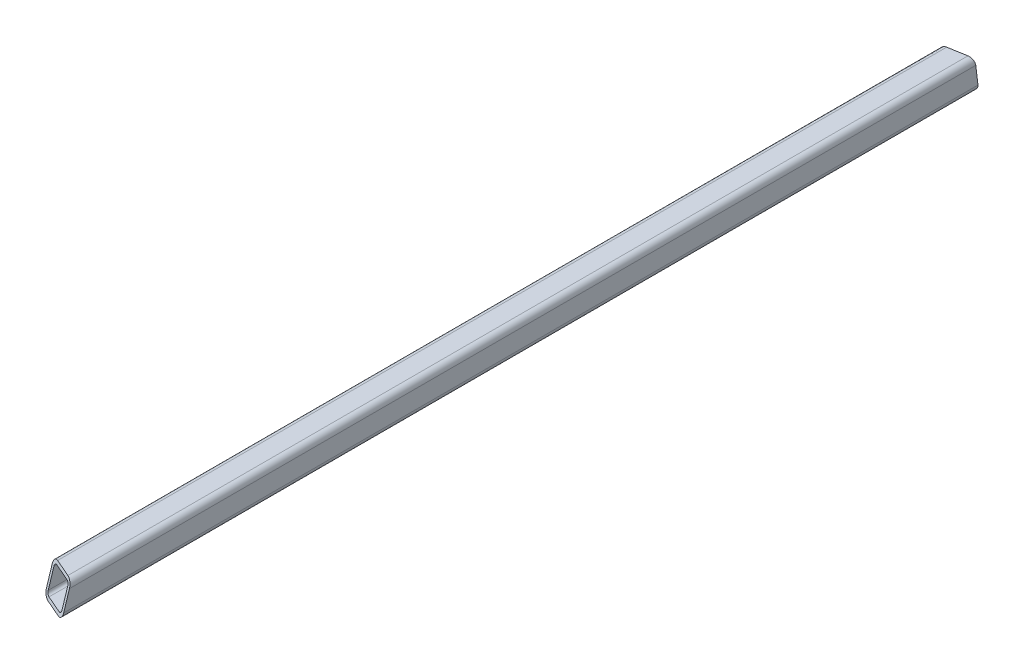
ISO-10303-21;
HEADER;
FILE_DESCRIPTION(('STEP AP214'),'2;1');
FILE_NAME('part.step','',(''),(''),'','','');
FILE_SCHEMA(('AUTOMOTIVE_DESIGN { 1 0 10303 214 1 1 1 1 }'));
ENDSEC;
DATA;
#1=APPLICATION_CONTEXT('core data for automotive mechanical design processes');
#2=APPLICATION_PROTOCOL_DEFINITION('international standard','automotive_design',2000,#1);
#3=PRODUCT_CONTEXT('',#1,'mechanical');
#4=PRODUCT('Part','Part','',(#3));
#5=PRODUCT_RELATED_PRODUCT_CATEGORY('part','',(#4));
#6=PRODUCT_DEFINITION_FORMATION('','',#4);
#7=PRODUCT_DEFINITION_CONTEXT('part definition',#1,'design');
#8=PRODUCT_DEFINITION('design','',#6,#7);
#9=PRODUCT_DEFINITION_SHAPE('','',#8);
#10=(LENGTH_UNIT() NAMED_UNIT(*) SI_UNIT(.MILLI.,.METRE.));
#11=(NAMED_UNIT(*) PLANE_ANGLE_UNIT() SI_UNIT($,.RADIAN.));
#12=(NAMED_UNIT(*) SI_UNIT($,.STERADIAN.) SOLID_ANGLE_UNIT());
#13=UNCERTAINTY_MEASURE_WITH_UNIT(LENGTH_MEASURE(1.E-05),#10,'distance_accuracy_value','');
#14=(GEOMETRIC_REPRESENTATION_CONTEXT(3) GLOBAL_UNCERTAINTY_ASSIGNED_CONTEXT((#13)) GLOBAL_UNIT_ASSIGNED_CONTEXT((#10,
#11,#12)) REPRESENTATION_CONTEXT('',''));
#15=CARTESIAN_POINT('',(0.,0.,0.));
#16=DIRECTION('',(0.,0.,1.));
#17=DIRECTION('',(1.,0.,0.));
#18=AXIS2_PLACEMENT_3D('',#15,#16,#17);
#19=CARTESIAN_POINT('',(-53.9999999999972,-74.0000000000028,-1085.));
#20=DIRECTION('',(0.,0.,-1.));
#21=DIRECTION('',(0.,1.,0.));
#22=AXIS2_PLACEMENT_3D('',#19,#20,#21);
#23=CYLINDRICAL_SURFACE('',#22,4.);
#24=CARTESIAN_POINT('',(-54.0000000000031,-73.9999999999969,-1680.31375090924));
#25=DIRECTION('',(-0.168171921974844,0.116989163112938,-0.9787909584653));
#26=DIRECTION('',(0.803494589264768,-0.558952757749404,-0.204861562101285));
#27=AXIS2_PLACEMENT_3D('',#24,#25,#26);
#28=ELLIPSE('',#27,4.08667444810873,4.);
#29=CARTESIAN_POINT('',(-54.0000000000031,-69.9999999999969,-1679.83565428564));
#30=VERTEX_POINT('',#29);
#31=CARTESIAN_POINT('',(-50.0000000000031,-73.9999999999969,-1681.00101480566));
#32=VERTEX_POINT('',#31);
#33=EDGE_CURVE('E185',#30,#32,#28,.T.);
#34=ORIENTED_EDGE('',*,*,#33,.F.);
#35=DIRECTION('',(0.,0.,-1.));
#36=VECTOR('',#35,1.);
#37=CARTESIAN_POINT('',(-53.9999999999972,-70.0000000000028,-1085.));
#38=LINE('',#37,#36);
#39=CARTESIAN_POINT('',(-53.9999999999972,-70.0000000000028,-1085.56756144426));
#40=VERTEX_POINT('',#39);
#41=EDGE_CURVE('E265',#40,#30,#38,.T.);
#42=ORIENTED_EDGE('',*,*,#41,.F.);
#43=CARTESIAN_POINT('',(-53.9999999999972,-74.0000000000028,-1084.3012888993));
#44=DIRECTION('',(-0.381589956920131,0.278969159106099,0.881229432693512));
#45=DIRECTION('',(-0.711394711093305,0.520079684350198,-0.472688784460422));
#46=AXIS2_PLACEMENT_3D('',#43,#44,#45);
#47=ELLIPSE('',#46,4.53911302959308,4.);
#48=CARTESIAN_POINT('',(-49.9999999999972,-74.0000000000027,-1082.56920895388));
#49=VERTEX_POINT('',#48);
#50=EDGE_CURVE('E176',#49,#40,#47,.T.);
#51=ORIENTED_EDGE('',*,*,#50,.F.);
#52=DIRECTION('',(0.,0.,-1.));
#53=VECTOR('',#52,1.);
#54=CARTESIAN_POINT('',(-49.9999999999972,-74.0000000000028,-1085.));
#55=LINE('',#54,#53);
#56=EDGE_CURVE('E45',#49,#32,#55,.T.);
#57=ORIENTED_EDGE('',*,*,#56,.T.);
#58=EDGE_LOOP('',(#34,#42,#51,#57));
#59=FACE_BOUND('',#58,.T.);
#60=ADVANCED_FACE('F41',(#59),#23,.T.);
#61=CARTESIAN_POINT('',(-53.9999999999972,-70.0000000000028,-1085.));
#62=DIRECTION('',(0.,-1.,0.));
#63=DIRECTION('',(0.,0.,-1.));
#64=AXIS2_PLACEMENT_3D('',#61,#62,#63);
#65=PLANE('',#64);
#66=DIRECTION('',(0.985558600813722,0.,-0.169334711037339));
#67=VECTOR('',#66,1.);
#68=CARTESIAN_POINT('',(-153.27169458501,-69.999999999997,-1662.77919137936));
#69=LINE('',#68,#67);
#70=CARTESIAN_POINT('',(-66.0000000000031,-69.9999999999969,-1677.77386259637));
#71=VERTEX_POINT('',#70);
#72=EDGE_CURVE('E182',#71,#30,#69,.T.);
#73=ORIENTED_EDGE('',*,*,#72,.F.);
#74=DIRECTION('',(0.,0.,-1.));
#75=VECTOR('',#74,1.);
#76=CARTESIAN_POINT('',(-65.9999999999972,-70.0000000000028,-1085.));
#77=LINE('',#76,#75);
#78=CARTESIAN_POINT('',(-65.9999999999973,-70.0000000000027,-1090.76380128051));
#79=VERTEX_POINT('',#78);
#80=EDGE_CURVE('E263',#79,#71,#77,.T.);
#81=ORIENTED_EDGE('',*,*,#80,.F.);
#82=DIRECTION('',(-0.917660497954151,0.,-0.397365336302174));
#83=VECTOR('',#82,1.);
#84=CARTESIAN_POINT('',(-53.7930407214899,-70.0000000000028,-1085.4779439403));
#85=LINE('',#84,#83);
#86=EDGE_CURVE('E281',#40,#79,#85,.T.);
#87=ORIENTED_EDGE('',*,*,#86,.F.);
#88=ORIENTED_EDGE('',*,*,#41,.T.);
#89=EDGE_LOOP('',(#73,#81,#87,#88));
#90=FACE_BOUND('',#89,.T.);
#91=ADVANCED_FACE('F272',(#90),#65,.F.);
#92=CARTESIAN_POINT('',(-65.9999999999972,-74.0000000000028,-1085.));
#93=DIRECTION('',(0.,0.,-1.));
#94=DIRECTION('',(0.,1.,0.));
#95=AXIS2_PLACEMENT_3D('',#92,#93,#94);
#96=CYLINDRICAL_SURFACE('',#95,4.);
#97=CARTESIAN_POINT('',(-66.0000000000031,-73.9999999999969,-1678.25195921997));
#98=DIRECTION('',(-0.168171921974844,0.116989163112938,-0.9787909584653));
#99=DIRECTION('',(0.803494589264768,-0.558952757749404,-0.204861562101285));
#100=AXIS2_PLACEMENT_3D('',#97,#98,#99);
#101=ELLIPSE('',#100,4.08667444810873,4.);
#102=CARTESIAN_POINT('',(-70.0000000000031,-73.9999999999969,-1677.56469532354));
#103=VERTEX_POINT('',#102);
#104=EDGE_CURVE('E11',#103,#71,#101,.T.);
#105=ORIENTED_EDGE('',*,*,#104,.F.);
#106=DIRECTION('',(0.,0.,-1.));
#107=VECTOR('',#106,1.);
#108=CARTESIAN_POINT('',(-69.9999999999972,-74.0000000000028,-1085.));
#109=LINE('',#108,#107);
#110=CARTESIAN_POINT('',(-69.9999999999973,-74.0000000000027,-1091.22960868097));
#111=VERTEX_POINT('',#110);
#112=EDGE_CURVE('E260',#111,#103,#109,.T.);
#113=ORIENTED_EDGE('',*,*,#112,.F.);
#114=CARTESIAN_POINT('',(-65.9999999999973,-74.0000000000027,-1089.49752873556));
#115=DIRECTION('',(-0.381589956920131,0.278969159106099,0.881229432693512));
#116=DIRECTION('',(-0.711394711093305,0.520079684350198,-0.472688784460422));
#117=AXIS2_PLACEMENT_3D('',#114,#115,#116);
#118=ELLIPSE('',#117,4.53911302959308,4.);
#119=EDGE_CURVE('E278',#79,#111,#118,.T.);
#120=ORIENTED_EDGE('',*,*,#119,.F.);
#121=ORIENTED_EDGE('',*,*,#80,.T.);
#122=EDGE_LOOP('',(#105,#113,#120,#121));
#123=FACE_BOUND('',#122,.T.);
#124=ADVANCED_FACE('F275',(#123),#96,.T.);
#125=CARTESIAN_POINT('',(-69.9999999999972,-86.0000000000028,-1085.));
#126=DIRECTION('',(1.,0.,0.));
#127=DIRECTION('',(0.,0.,-1.));
#128=AXIS2_PLACEMENT_3D('',#125,#126,#127);
#129=PLANE('',#128);
#130=DIRECTION('',(0.,0.99293262211417,0.118679433523588));
#131=VECTOR('',#130,1.);
#132=CARTESIAN_POINT('',(-70.000000000003,-16.0027550003502,-1670.63262357044));
#133=LINE('',#132,#131);
#134=CARTESIAN_POINT('',(-70.0000000000031,-85.9999999999969,-1678.99898519434));
#135=VERTEX_POINT('',#134);
#136=EDGE_CURVE('E51',#135,#103,#133,.T.);
#137=ORIENTED_EDGE('',*,*,#136,.F.);
#138=DIRECTION('',(0.,0.,-1.));
#139=VECTOR('',#138,1.);
#140=CARTESIAN_POINT('',(-69.9999999999972,-86.0000000000028,-1085.));
#141=LINE('',#140,#139);
#142=CARTESIAN_POINT('',(-69.9999999999973,-86.0000000000028,-1087.43079104612));
#143=VERTEX_POINT('',#142);
#144=EDGE_CURVE('E257',#143,#135,#141,.T.);
#145=ORIENTED_EDGE('',*,*,#144,.F.);
#146=DIRECTION('',(0.,-0.953369256848505,0.301806328787403));
#147=VECTOR('',#146,1.);
#148=CARTESIAN_POINT('',(-69.9999999999973,-86.6994184971696,-1087.20937743602));
#149=LINE('',#148,#147);
#150=EDGE_CURVE('E280',#111,#143,#149,.T.);
#151=ORIENTED_EDGE('',*,*,#150,.F.);
#152=ORIENTED_EDGE('',*,*,#112,.T.);
#153=EDGE_LOOP('',(#137,#145,#151,#152));
#154=FACE_BOUND('',#153,.T.);
#155=ADVANCED_FACE('F291',(#154),#129,.F.);
#156=CARTESIAN_POINT('',(-65.9999999999972,-86.0000000000028,-1085.));
#157=DIRECTION('',(0.,0.,-1.));
#158=DIRECTION('',(0.,1.,0.));
#159=AXIS2_PLACEMENT_3D('',#156,#157,#158);
#160=CYLINDRICAL_SURFACE('',#159,4.);
#161=CARTESIAN_POINT('',(-66.0000000000031,-85.9999999999969,-1679.68624909076));
#162=DIRECTION('',(-0.168171921974844,0.116989163112938,-0.9787909584653));
#163=DIRECTION('',(0.803494589264768,-0.558952757749404,-0.204861562101285));
#164=AXIS2_PLACEMENT_3D('',#161,#162,#163);
#165=ELLIPSE('',#164,4.08667444810873,4.);
#166=CARTESIAN_POINT('',(-66.0000000000031,-89.9999999999969,-1680.16434571436));
#167=VERTEX_POINT('',#166);
#168=EDGE_CURVE('E200',#167,#135,#165,.T.);
#169=ORIENTED_EDGE('',*,*,#168,.F.);
#170=DIRECTION('',(0.,0.,-1.));
#171=VECTOR('',#170,1.);
#172=CARTESIAN_POINT('',(-65.9999999999972,-90.0000000000028,-1085.));
#173=LINE('',#172,#171);
#174=CARTESIAN_POINT('',(-65.9999999999972,-90.0000000000028,-1084.43243855574));
#175=VERTEX_POINT('',#174);
#176=EDGE_CURVE('E254',#175,#167,#173,.T.);
#177=ORIENTED_EDGE('',*,*,#176,.F.);
#178=CARTESIAN_POINT('',(-65.9999999999972,-86.0000000000028,-1085.6987111007));
#179=DIRECTION('',(-0.381589956920131,0.278969159106099,0.881229432693512));
#180=DIRECTION('',(-0.711394711093305,0.520079684350198,-0.472688784460422));
#181=AXIS2_PLACEMENT_3D('',#178,#179,#180);
#182=ELLIPSE('',#181,4.53911302959308,4.);
#183=EDGE_CURVE('E187',#143,#175,#182,.T.);
#184=ORIENTED_EDGE('',*,*,#183,.F.);
#185=ORIENTED_EDGE('',*,*,#144,.T.);
#186=EDGE_LOOP('',(#169,#177,#184,#185));
#187=FACE_BOUND('',#186,.T.);
#188=ADVANCED_FACE('F289',(#187),#160,.T.);
#189=CARTESIAN_POINT('',(-65.9999999999972,-90.0000000000028,-1085.));
#190=DIRECTION('',(0.,1.,0.));
#191=DIRECTION('',(0.,0.,1.));
#192=AXIS2_PLACEMENT_3D('',#189,#190,#191);
#193=PLANE('',#192);
#194=DIRECTION('',(-0.985558600813722,0.,0.169334711037339));
#195=VECTOR('',#194,1.);
#196=CARTESIAN_POINT('',(-165.32654966118,-89.9999999999971,-1663.09845782974));
#197=LINE('',#196,#195);
#198=CARTESIAN_POINT('',(-54.0000000000031,-89.9999999999969,-1682.22613740363));
#199=VERTEX_POINT('',#198);
#200=EDGE_CURVE('E203',#199,#167,#197,.T.);
#201=ORIENTED_EDGE('',*,*,#200,.F.);
#202=DIRECTION('',(0.,0.,-1.));
#203=VECTOR('',#202,1.);
#204=CARTESIAN_POINT('',(-53.9999999999972,-90.0000000000028,-1085.));
#205=LINE('',#204,#203);
#206=CARTESIAN_POINT('',(-53.9999999999972,-90.0000000000028,-1079.23619871949));
#207=VERTEX_POINT('',#206);
#208=EDGE_CURVE('E252',#207,#199,#205,.T.);
#209=ORIENTED_EDGE('',*,*,#208,.F.);
#210=DIRECTION('',(0.917660497954151,0.,0.397365336302174));
#211=VECTOR('',#210,1.);
#212=CARTESIAN_POINT('',(-66.2069592785043,-90.0000000000028,-1084.5220560597));
#213=LINE('',#212,#211);
#214=EDGE_CURVE('E181',#175,#207,#213,.T.);
#215=ORIENTED_EDGE('',*,*,#214,.F.);
#216=ORIENTED_EDGE('',*,*,#176,.T.);
#217=EDGE_LOOP('',(#201,#209,#215,#216));
#218=FACE_BOUND('',#217,.T.);
#219=ADVANCED_FACE('F293',(#218),#193,.F.);
#220=CARTESIAN_POINT('',(-53.9999999999972,-86.0000000000028,-1085.));
#221=DIRECTION('',(0.,0.,-1.));
#222=DIRECTION('',(0.,1.,0.));
#223=AXIS2_PLACEMENT_3D('',#220,#221,#222);
#224=CYLINDRICAL_SURFACE('',#223,4.);
#225=CARTESIAN_POINT('',(-54.0000000000031,-85.9999999999969,-1681.74804078003));
#226=DIRECTION('',(-0.168171921974844,0.116989163112938,-0.9787909584653));
#227=DIRECTION('',(0.803494589264768,-0.558952757749404,-0.204861562101285));
#228=AXIS2_PLACEMENT_3D('',#225,#226,#227);
#229=ELLIPSE('',#228,4.08667444810873,4.);
#230=CARTESIAN_POINT('',(-50.0000000000031,-85.999999999997,-1682.43530467646));
#231=VERTEX_POINT('',#230);
#232=EDGE_CURVE('E164',#231,#199,#229,.T.);
#233=ORIENTED_EDGE('',*,*,#232,.F.);
#234=DIRECTION('',(0.,0.,-1.));
#235=VECTOR('',#234,1.);
#236=CARTESIAN_POINT('',(-49.9999999999972,-86.0000000000028,-1085.));
#237=LINE('',#236,#235);
#238=CARTESIAN_POINT('',(-49.9999999999972,-86.0000000000029,-1078.77039131902));
#239=VERTEX_POINT('',#238);
#240=EDGE_CURVE('E156',#239,#231,#237,.T.);
#241=ORIENTED_EDGE('',*,*,#240,.F.);
#242=CARTESIAN_POINT('',(-53.9999999999972,-86.0000000000028,-1080.50247126444));
#243=DIRECTION('',(-0.381589956920131,0.278969159106099,0.881229432693512));
#244=DIRECTION('',(-0.711394711093305,0.520079684350198,-0.472688784460422));
#245=AXIS2_PLACEMENT_3D('',#242,#243,#244);
#246=ELLIPSE('',#245,4.53911302959308,4.);
#247=EDGE_CURVE('E161',#207,#239,#246,.T.);
#248=ORIENTED_EDGE('',*,*,#247,.F.);
#249=ORIENTED_EDGE('',*,*,#208,.T.);
#250=EDGE_LOOP('',(#233,#241,#248,#249));
#251=FACE_BOUND('',#250,.T.);
#252=ADVANCED_FACE('F158',(#251),#224,.T.);
#253=CARTESIAN_POINT('',(-65.9999999999972,-74.0000000000028,-1085.));
#254=DIRECTION('',(0.,0.,-1.));
#255=DIRECTION('',(0.,1.,0.));
#256=AXIS2_PLACEMENT_3D('',#253,#254,#255);
#257=CYLINDRICAL_SURFACE('',#256,2.);
#258=DIRECTION('',(0.,0.,-1.));
#259=VECTOR('',#258,1.);
#260=CARTESIAN_POINT('',(-67.9999999999972,-74.0000000000028,-1085.));
#261=LINE('',#260,#259);
#262=CARTESIAN_POINT('',(-67.9999999999973,-74.0000000000026,-1090.36356870827));
#263=VERTEX_POINT('',#262);
#264=CARTESIAN_POINT('',(-68.0000000000031,-73.9999999999969,-1677.90832727175));
#265=VERTEX_POINT('',#264);
#266=EDGE_CURVE('E209',#263,#265,#261,.T.);
#267=ORIENTED_EDGE('',*,*,#266,.T.);
#268=CARTESIAN_POINT('',(-66.0000000000031,-73.9999999999969,-1678.25195921997));
#269=DIRECTION('',(-0.168171921974844,0.116989163112938,-0.9787909584653));
#270=DIRECTION('',(0.803494589264768,-0.558952757749404,-0.204861562101285));
#271=AXIS2_PLACEMENT_3D('',#268,#269,#270);
#272=ELLIPSE('',#271,2.04333722405436,2.);
#273=CARTESIAN_POINT('',(-66.0000000000031,-71.9999999999969,-1678.01291090817));
#274=VERTEX_POINT('',#273);
#275=EDGE_CURVE('E87',#265,#274,#272,.T.);
#276=ORIENTED_EDGE('',*,*,#275,.T.);
#277=DIRECTION('',(0.,0.,-1.));
#278=VECTOR('',#277,1.);
#279=CARTESIAN_POINT('',(-65.9999999999972,-72.0000000000028,-1085.));
#280=LINE('',#279,#278);
#281=CARTESIAN_POINT('',(-65.9999999999973,-72.0000000000027,-1090.13066500803));
#282=VERTEX_POINT('',#281);
#283=EDGE_CURVE('E212',#282,#274,#280,.T.);
#284=ORIENTED_EDGE('',*,*,#283,.F.);
#285=CARTESIAN_POINT('',(-65.9999999999973,-74.0000000000027,-1089.49752873556));
#286=DIRECTION('',(-0.381589956920131,0.278969159106099,0.881229432693512));
#287=DIRECTION('',(-0.711394711093305,0.520079684350198,-0.472688784460422));
#288=AXIS2_PLACEMENT_3D('',#285,#286,#287);
#289=ELLIPSE('',#288,2.26955651479654,2.);
#290=EDGE_CURVE('E208',#282,#263,#289,.T.);
#291=ORIENTED_EDGE('',*,*,#290,.T.);
#292=EDGE_LOOP('',(#267,#276,#284,#291));
#293=FACE_BOUND('',#292,.T.);
#294=ADVANCED_FACE('F300',(#293),#257,.F.);
#295=CARTESIAN_POINT('',(-53.9999999999972,-72.0000000000028,-1085.));
#296=DIRECTION('',(0.,-1.,0.));
#297=DIRECTION('',(0.,0.,-1.));
#298=AXIS2_PLACEMENT_3D('',#295,#296,#297);
#299=PLANE('',#298);
#300=ORIENTED_EDGE('',*,*,#283,.T.);
#301=DIRECTION('',(0.985558600813722,0.,-0.169334711037339));
#302=VECTOR('',#301,1.);
#303=CARTESIAN_POINT('',(-153.311589185861,-71.9999999999971,-1663.01138516146));
#304=LINE('',#303,#302);
#305=CARTESIAN_POINT('',(-54.0000000000031,-71.9999999999969,-1680.07470259744));
#306=VERTEX_POINT('',#305);
#307=EDGE_CURVE('E60',#274,#306,#304,.T.);
#308=ORIENTED_EDGE('',*,*,#307,.T.);
#309=DIRECTION('',(0.,0.,-1.));
#310=VECTOR('',#309,1.);
#311=CARTESIAN_POINT('',(-53.9999999999972,-72.0000000000028,-1085.));
#312=LINE('',#311,#310);
#313=CARTESIAN_POINT('',(-53.9999999999972,-72.0000000000028,-1084.93442517178));
#314=VERTEX_POINT('',#313);
#315=EDGE_CURVE('E217',#314,#306,#312,.T.);
#316=ORIENTED_EDGE('',*,*,#315,.F.);
#317=DIRECTION('',(-0.917660497954151,0.,-0.397365336302174));
#318=VECTOR('',#317,1.);
#319=CARTESIAN_POINT('',(-54.0239116297848,-72.0000000000028,-1084.94477938538));
#320=LINE('',#319,#318);
#321=EDGE_CURVE('E211',#314,#282,#320,.T.);
#322=ORIENTED_EDGE('',*,*,#321,.T.);
#323=EDGE_LOOP('',(#300,#308,#316,#322));
#324=FACE_BOUND('',#323,.T.);
#325=ADVANCED_FACE('F342',(#324),#299,.T.);
#326=CARTESIAN_POINT('',(-53.9999999999972,-74.0000000000028,-1085.));
#327=DIRECTION('',(0.,0.,-1.));
#328=DIRECTION('',(0.,1.,0.));
#329=AXIS2_PLACEMENT_3D('',#326,#327,#328);
#330=CYLINDRICAL_SURFACE('',#329,2.);
#331=ORIENTED_EDGE('',*,*,#315,.T.);
#332=CARTESIAN_POINT('',(-54.0000000000031,-73.9999999999969,-1680.31375090924));
#333=DIRECTION('',(-0.168171921974844,0.116989163112938,-0.9787909584653));
#334=DIRECTION('',(0.803494589264768,-0.558952757749404,-0.204861562101285));
#335=AXIS2_PLACEMENT_3D('',#332,#333,#334);
#336=ELLIPSE('',#335,2.04333722405436,2.);
#337=CARTESIAN_POINT('',(-52.0000000000031,-73.9999999999968,-1680.65738285745));
#338=VERTEX_POINT('',#337);
#339=EDGE_CURVE('E213',#306,#338,#336,.T.);
#340=ORIENTED_EDGE('',*,*,#339,.T.);
#341=DIRECTION('',(0.,0.,-1.));
#342=VECTOR('',#341,1.);
#343=CARTESIAN_POINT('',(-51.9999999999972,-74.0000000000028,-1085.));
#344=LINE('',#343,#342);
#345=CARTESIAN_POINT('',(-51.9999999999972,-74.0000000000027,-1083.43524892659));
#346=VERTEX_POINT('',#345);
#347=EDGE_CURVE('E222',#346,#338,#344,.T.);
#348=ORIENTED_EDGE('',*,*,#347,.F.);
#349=CARTESIAN_POINT('',(-53.9999999999972,-74.0000000000028,-1084.3012888993));
#350=DIRECTION('',(-0.381589956920131,0.278969159106099,0.881229432693512));
#351=DIRECTION('',(-0.711394711093305,0.520079684350198,-0.472688784460422));
#352=AXIS2_PLACEMENT_3D('',#349,#350,#351);
#353=ELLIPSE('',#352,2.26955651479654,2.);
#354=EDGE_CURVE('E216',#346,#314,#353,.T.);
#355=ORIENTED_EDGE('',*,*,#354,.T.);
#356=EDGE_LOOP('',(#331,#340,#348,#355));
#357=FACE_BOUND('',#356,.T.);
#358=ADVANCED_FACE('F352',(#357),#330,.F.);
#359=CARTESIAN_POINT('',(-51.9999999999972,-74.0000000000028,-1085.));
#360=DIRECTION('',(-1.,0.,0.));
#361=DIRECTION('',(0.,0.,1.));
#362=AXIS2_PLACEMENT_3D('',#359,#360,#361);
#363=PLANE('',#362);
#364=ORIENTED_EDGE('',*,*,#347,.T.);
#365=DIRECTION('',(0.,-0.99293262211417,-0.118679433523588));
#366=VECTOR('',#365,1.);
#367=CARTESIAN_POINT('',(-52.000000000003,-3.80732829016217,-1672.26766302098));
#368=LINE('',#367,#366);
#369=CARTESIAN_POINT('',(-52.0000000000031,-85.9999999999969,-1682.09167272825));
#370=VERTEX_POINT('',#369);
#371=EDGE_CURVE('E218',#338,#370,#368,.T.);
#372=ORIENTED_EDGE('',*,*,#371,.T.);
#373=DIRECTION('',(0.,0.,-1.));
#374=VECTOR('',#373,1.);
#375=CARTESIAN_POINT('',(-51.9999999999972,-86.0000000000028,-1085.));
#376=LINE('',#375,#374);
#377=CARTESIAN_POINT('',(-51.9999999999972,-86.0000000000028,-1079.63643129173));
#378=VERTEX_POINT('',#377);
#379=EDGE_CURVE('E227',#378,#370,#376,.T.);
#380=ORIENTED_EDGE('',*,*,#379,.F.);
#381=DIRECTION('',(0.,0.953369256848505,-0.301806328787403));
#382=VECTOR('',#381,1.);
#383=CARTESIAN_POINT('',(-51.9999999999972,-73.5497696743848,-1083.57777750165));
#384=LINE('',#383,#382);
#385=EDGE_CURVE('E221',#378,#346,#384,.T.);
#386=ORIENTED_EDGE('',*,*,#385,.T.);
#387=EDGE_LOOP('',(#364,#372,#380,#386));
#388=FACE_BOUND('',#387,.T.);
#389=ADVANCED_FACE('F362',(#388),#363,.T.);
#390=CARTESIAN_POINT('',(-53.9999999999972,-86.0000000000028,-1085.));
#391=DIRECTION('',(0.,0.,-1.));
#392=DIRECTION('',(0.,1.,0.));
#393=AXIS2_PLACEMENT_3D('',#390,#391,#392);
#394=CYLINDRICAL_SURFACE('',#393,2.);
#395=ORIENTED_EDGE('',*,*,#379,.T.);
#396=CARTESIAN_POINT('',(-54.0000000000031,-85.9999999999969,-1681.74804078003));
#397=DIRECTION('',(-0.168171921974844,0.116989163112938,-0.9787909584653));
#398=DIRECTION('',(0.803494589264768,-0.558952757749404,-0.204861562101285));
#399=AXIS2_PLACEMENT_3D('',#396,#397,#398);
#400=ELLIPSE('',#399,2.04333722405436,2.);
#401=CARTESIAN_POINT('',(-54.0000000000031,-87.9999999999969,-1681.98708909183));
#402=VERTEX_POINT('',#401);
#403=EDGE_CURVE('E223',#370,#402,#400,.T.);
#404=ORIENTED_EDGE('',*,*,#403,.T.);
#405=DIRECTION('',(0.,0.,-1.));
#406=VECTOR('',#405,1.);
#407=CARTESIAN_POINT('',(-53.9999999999972,-88.0000000000028,-1085.));
#408=LINE('',#407,#406);
#409=CARTESIAN_POINT('',(-53.9999999999972,-88.0000000000028,-1079.86933499197));
#410=VERTEX_POINT('',#409);
#411=EDGE_CURVE('E232',#410,#402,#408,.T.);
#412=ORIENTED_EDGE('',*,*,#411,.F.);
#413=CARTESIAN_POINT('',(-53.9999999999972,-86.0000000000028,-1080.50247126444));
#414=DIRECTION('',(-0.381589956920131,0.278969159106099,0.881229432693512));
#415=DIRECTION('',(-0.711394711093305,0.520079684350198,-0.472688784460422));
#416=AXIS2_PLACEMENT_3D('',#413,#414,#415);
#417=ELLIPSE('',#416,2.26955651479654,2.);
#418=EDGE_CURVE('E226',#410,#378,#417,.T.);
#419=ORIENTED_EDGE('',*,*,#418,.T.);
#420=EDGE_LOOP('',(#395,#404,#412,#419));
#421=FACE_BOUND('',#420,.T.);
#422=ADVANCED_FACE('F372',(#421),#394,.F.);
#423=CARTESIAN_POINT('',(-65.9999999999972,-88.0000000000028,-1085.));
#424=DIRECTION('',(0.,1.,0.));
#425=DIRECTION('',(0.,0.,1.));
#426=AXIS2_PLACEMENT_3D('',#423,#424,#425);
#427=PLANE('',#426);
#428=ORIENTED_EDGE('',*,*,#411,.T.);
#429=DIRECTION('',(-0.985558600813722,0.,0.169334711037339));
#430=VECTOR('',#429,1.);
#431=CARTESIAN_POINT('',(-165.286655060329,-87.9999999999971,-1662.86626404765));
#432=LINE('',#431,#430);
#433=CARTESIAN_POINT('',(-66.0000000000031,-87.9999999999969,-1679.92529740256));
#434=VERTEX_POINT('',#433);
#435=EDGE_CURVE('E228',#402,#434,#432,.T.);
#436=ORIENTED_EDGE('',*,*,#435,.T.);
#437=DIRECTION('',(0.,0.,-1.));
#438=VECTOR('',#437,1.);
#439=CARTESIAN_POINT('',(-65.9999999999972,-88.0000000000028,-1085.));
#440=LINE('',#439,#438);
#441=CARTESIAN_POINT('',(-65.9999999999972,-88.0000000000028,-1085.06557482822));
#442=VERTEX_POINT('',#441);
#443=EDGE_CURVE('E236',#442,#434,#440,.T.);
#444=ORIENTED_EDGE('',*,*,#443,.F.);
#445=DIRECTION('',(0.917660497954151,0.,0.397365336302174));
#446=VECTOR('',#445,1.);
#447=CARTESIAN_POINT('',(-65.9760883702094,-88.0000000000028,-1085.05522061462));
#448=LINE('',#447,#446);
#449=EDGE_CURVE('E231',#442,#410,#448,.T.);
#450=ORIENTED_EDGE('',*,*,#449,.T.);
#451=EDGE_LOOP('',(#428,#436,#444,#450));
#452=FACE_BOUND('',#451,.T.);
#453=ADVANCED_FACE('F382',(#452),#427,.T.);
#454=CARTESIAN_POINT('',(-65.9999999999972,-86.0000000000028,-1085.));
#455=DIRECTION('',(0.,0.,-1.));
#456=DIRECTION('',(0.,1.,0.));
#457=AXIS2_PLACEMENT_3D('',#454,#455,#456);
#458=CYLINDRICAL_SURFACE('',#457,2.);
#459=ORIENTED_EDGE('',*,*,#443,.T.);
#460=CARTESIAN_POINT('',(-66.0000000000031,-85.9999999999969,-1679.68624909076));
#461=DIRECTION('',(-0.168171921974844,0.116989163112938,-0.9787909584653));
#462=DIRECTION('',(0.803494589264768,-0.558952757749404,-0.204861562101285));
#463=AXIS2_PLACEMENT_3D('',#460,#461,#462);
#464=ELLIPSE('',#463,2.04333722405436,2.);
#465=CARTESIAN_POINT('',(-68.0000000000031,-85.999999999997,-1679.34261714255));
#466=VERTEX_POINT('',#465);
#467=EDGE_CURVE('E233',#434,#466,#464,.T.);
#468=ORIENTED_EDGE('',*,*,#467,.T.);
#469=DIRECTION('',(0.,0.,-1.));
#470=VECTOR('',#469,1.);
#471=CARTESIAN_POINT('',(-67.9999999999972,-86.0000000000028,-1085.));
#472=LINE('',#471,#470);
#473=CARTESIAN_POINT('',(-67.9999999999973,-86.0000000000028,-1086.56475107341));
#474=VERTEX_POINT('',#473);
#475=EDGE_CURVE('E194',#474,#466,#472,.T.);
#476=ORIENTED_EDGE('',*,*,#475,.F.);
#477=CARTESIAN_POINT('',(-65.9999999999972,-86.0000000000028,-1085.6987111007));
#478=DIRECTION('',(-0.381589956920131,0.278969159106099,0.881229432693512));
#479=DIRECTION('',(-0.711394711093305,0.520079684350198,-0.472688784460422));
#480=AXIS2_PLACEMENT_3D('',#477,#478,#479);
#481=ELLIPSE('',#480,2.26955651479654,2.);
#482=EDGE_CURVE('E235',#474,#442,#481,.T.);
#483=ORIENTED_EDGE('',*,*,#482,.T.);
#484=EDGE_LOOP('',(#459,#468,#476,#483));
#485=FACE_BOUND('',#484,.T.);
#486=ADVANCED_FACE('F392',(#485),#458,.F.);
#487=CARTESIAN_POINT('',(-67.9999999999972,-86.0000000000028,-1085.));
#488=DIRECTION('',(1.,0.,0.));
#489=DIRECTION('',(0.,0.,-1.));
#490=AXIS2_PLACEMENT_3D('',#487,#488,#489);
#491=PLANE('',#490);
#492=ORIENTED_EDGE('',*,*,#475,.T.);
#493=DIRECTION('',(0.,0.99293262211417,0.118679433523588));
#494=VECTOR('',#493,1.);
#495=CARTESIAN_POINT('',(-68.000000000003,-15.9622611775184,-1670.97141552866));
#496=LINE('',#495,#494);
#497=EDGE_CURVE('E82',#466,#265,#496,.T.);
#498=ORIENTED_EDGE('',*,*,#497,.T.);
#499=ORIENTED_EDGE('',*,*,#266,.F.);
#500=DIRECTION('',(0.,-0.953369256848505,0.301806328787403));
#501=VECTOR('',#500,1.);
#502=CARTESIAN_POINT('',(-67.9999999999973,-86.4502303256209,-1086.42222249835));
#503=LINE('',#502,#501);
#504=EDGE_CURVE('E169',#263,#474,#503,.T.);
#505=ORIENTED_EDGE('',*,*,#504,.T.);
#506=EDGE_LOOP('',(#492,#498,#499,#505));
#507=FACE_BOUND('',#506,.T.);
#508=ADVANCED_FACE('F402',(#507),#491,.T.);
#509=CARTESIAN_POINT('',(-49.9999999999972,-74.0000000000028,-1085.));
#510=DIRECTION('',(-1.,0.,0.));
#511=DIRECTION('',(0.,0.,1.));
#512=AXIS2_PLACEMENT_3D('',#509,#510,#511);
#513=PLANE('',#512);
#514=DIRECTION('',(0.,-0.99293262211417,-0.118679433523588));
#515=VECTOR('',#514,1.);
#516=CARTESIAN_POINT('',(-50.000000000003,-3.76683446733042,-1672.6064549792));
#517=LINE('',#516,#515);
#518=EDGE_CURVE('E196',#32,#231,#517,.T.);
#519=ORIENTED_EDGE('',*,*,#518,.F.);
#520=ORIENTED_EDGE('',*,*,#56,.F.);
#521=DIRECTION('',(0.,0.953369256848505,-0.301806328787403));
#522=VECTOR('',#521,1.);
#523=CARTESIAN_POINT('',(-49.9999999999972,-73.3005815028361,-1082.79062256398));
#524=LINE('',#523,#522);
#525=EDGE_CURVE('E168',#239,#49,#524,.T.);
#526=ORIENTED_EDGE('',*,*,#525,.F.);
#527=ORIENTED_EDGE('',*,*,#240,.T.);
#528=EDGE_LOOP('',(#519,#520,#526,#527));
#529=FACE_BOUND('',#528,.T.);
#530=ADVANCED_FACE('F172',(#529),#513,.F.);
#531=CARTESIAN_POINT('',(-59.9999999999971,-80.0000000000029,-1085.));
#532=DIRECTION('',(-0.381589956920131,0.278969159106099,0.881229432693512));
#533=DIRECTION('',(0.917660497954151,0.,0.397365336302174));
#534=AXIS2_PLACEMENT_3D('',#531,#532,#533);
#535=PLANE('',#534);
#536=ORIENTED_EDGE('',*,*,#290,.F.);
#537=ORIENTED_EDGE('',*,*,#321,.F.);
#538=ORIENTED_EDGE('',*,*,#354,.F.);
#539=ORIENTED_EDGE('',*,*,#385,.F.);
#540=ORIENTED_EDGE('',*,*,#418,.F.);
#541=ORIENTED_EDGE('',*,*,#449,.F.);
#542=ORIENTED_EDGE('',*,*,#482,.F.);
#543=ORIENTED_EDGE('',*,*,#504,.F.);
#544=EDGE_LOOP('',(#536,#537,#538,#539,#540,#541,#542,#543));
#545=FACE_BOUND('',#544,.T.);
#546=ORIENTED_EDGE('',*,*,#525,.T.);
#547=ORIENTED_EDGE('',*,*,#50,.T.);
#548=ORIENTED_EDGE('',*,*,#86,.T.);
#549=ORIENTED_EDGE('',*,*,#119,.T.);
#550=ORIENTED_EDGE('',*,*,#150,.T.);
#551=ORIENTED_EDGE('',*,*,#183,.T.);
#552=ORIENTED_EDGE('',*,*,#214,.T.);
#553=ORIENTED_EDGE('',*,*,#247,.T.);
#554=EDGE_LOOP('',(#546,#547,#548,#549,#550,#551,#552,#553));
#555=FACE_BOUND('',#554,.T.);
#556=ADVANCED_FACE('F179',(#545,#555),#535,.T.);
#557=CARTESIAN_POINT('',(-60.0000000000029,-79.999999999997,-1680.));
#558=DIRECTION('',(-0.168171921974844,0.116989163112938,-0.9787909584653));
#559=DIRECTION('',(-0.985558600813722,0.,0.169334711037339));
#560=AXIS2_PLACEMENT_3D('',#557,#558,#559);
#561=PLANE('',#560);
#562=ORIENTED_EDGE('',*,*,#275,.F.);
#563=ORIENTED_EDGE('',*,*,#497,.F.);
#564=ORIENTED_EDGE('',*,*,#467,.F.);
#565=ORIENTED_EDGE('',*,*,#435,.F.);
#566=ORIENTED_EDGE('',*,*,#403,.F.);
#567=ORIENTED_EDGE('',*,*,#371,.F.);
#568=ORIENTED_EDGE('',*,*,#339,.F.);
#569=ORIENTED_EDGE('',*,*,#307,.F.);
#570=EDGE_LOOP('',(#562,#563,#564,#565,#566,#567,#568,#569));
#571=FACE_BOUND('',#570,.T.);
#572=ORIENTED_EDGE('',*,*,#72,.T.);
#573=ORIENTED_EDGE('',*,*,#33,.T.);
#574=ORIENTED_EDGE('',*,*,#518,.T.);
#575=ORIENTED_EDGE('',*,*,#232,.T.);
#576=ORIENTED_EDGE('',*,*,#200,.T.);
#577=ORIENTED_EDGE('',*,*,#168,.T.);
#578=ORIENTED_EDGE('',*,*,#136,.T.);
#579=ORIENTED_EDGE('',*,*,#104,.T.);
#580=EDGE_LOOP('',(#572,#573,#574,#575,#576,#577,#578,#579));
#581=FACE_BOUND('',#580,.T.);
#582=ADVANCED_FACE('F43',(#571,#581),#561,.T.);
#583=CLOSED_SHELL('',(#60,#91,#124,#155,#188,#219,#252,#294,#325,#358,#389,#422,#453,#486,#508,
#530,#556,#582));
#584=MANIFOLD_SOLID_BREP('B2',#583);
#585=ADVANCED_BREP_SHAPE_REPRESENTATION('',(#18,#584),#14);
#586=SHAPE_DEFINITION_REPRESENTATION(#9,#585);
ENDSEC;
END-ISO-10303-21;
